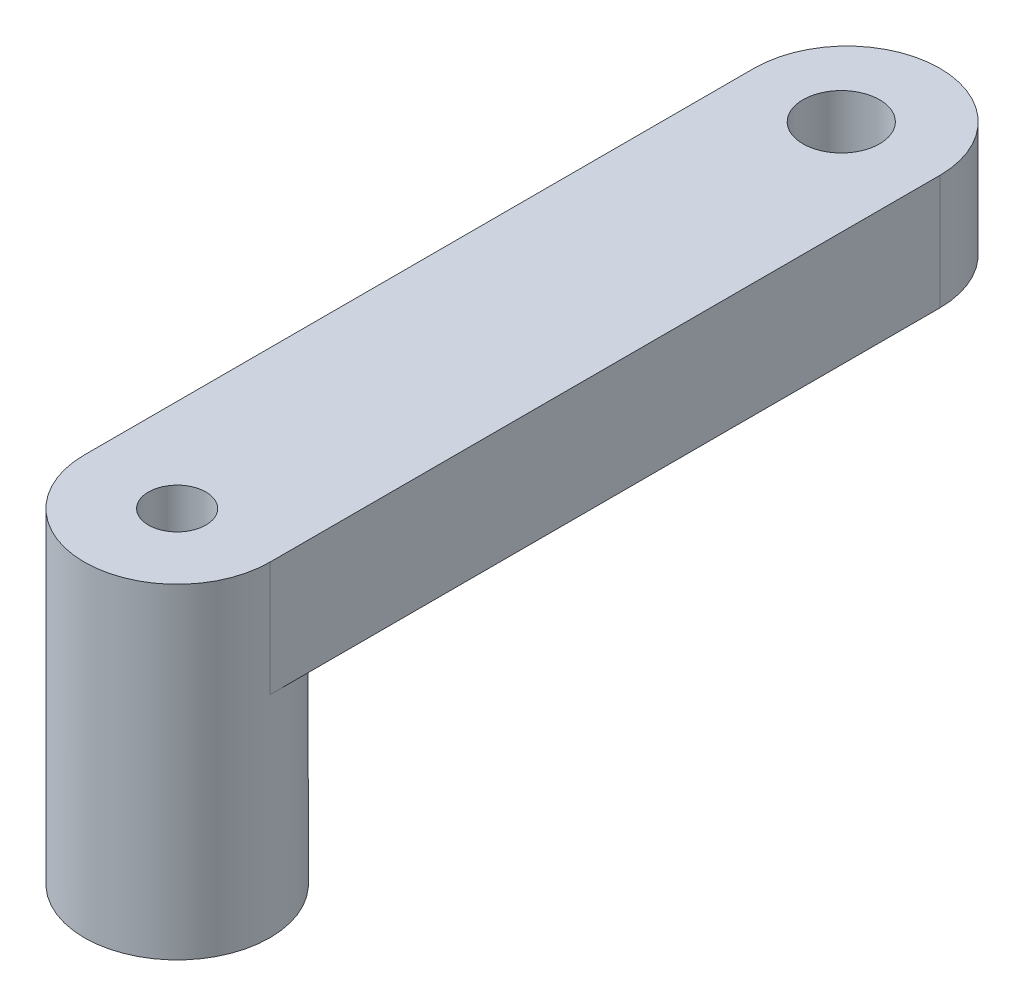
ISO-10303-21;
HEADER;
FILE_DESCRIPTION(('STEP AP214'),'2;1');
FILE_NAME('part.step','',(''),(''),'','','');
FILE_SCHEMA(('AUTOMOTIVE_DESIGN { 1 0 10303 214 1 1 1 1 }'));
ENDSEC;
DATA;
#1=APPLICATION_CONTEXT('core data for automotive mechanical design processes');
#2=APPLICATION_PROTOCOL_DEFINITION('international standard','automotive_design',2000,#1);
#3=PRODUCT_CONTEXT('',#1,'mechanical');
#4=PRODUCT('Part','Part','',(#3));
#5=PRODUCT_RELATED_PRODUCT_CATEGORY('part','',(#4));
#6=PRODUCT_DEFINITION_FORMATION('','',#4);
#7=PRODUCT_DEFINITION_CONTEXT('part definition',#1,'design');
#8=PRODUCT_DEFINITION('design','',#6,#7);
#9=PRODUCT_DEFINITION_SHAPE('','',#8);
#10=(LENGTH_UNIT() NAMED_UNIT(*) SI_UNIT(.MILLI.,.METRE.));
#11=(NAMED_UNIT(*) PLANE_ANGLE_UNIT() SI_UNIT($,.RADIAN.));
#12=(NAMED_UNIT(*) SI_UNIT($,.STERADIAN.) SOLID_ANGLE_UNIT());
#13=UNCERTAINTY_MEASURE_WITH_UNIT(LENGTH_MEASURE(1.E-05),#10,'distance_accuracy_value','');
#14=(GEOMETRIC_REPRESENTATION_CONTEXT(3) GLOBAL_UNCERTAINTY_ASSIGNED_CONTEXT((#13)) GLOBAL_UNIT_ASSIGNED_CONTEXT((#10,
#11,#12)) REPRESENTATION_CONTEXT('',''));
#15=CARTESIAN_POINT('',(0.,0.,0.));
#16=DIRECTION('',(0.,0.,1.));
#17=DIRECTION('',(1.,0.,0.));
#18=AXIS2_PLACEMENT_3D('',#15,#16,#17);
#19=CARTESIAN_POINT('',(0.,0.,0.));
#20=DIRECTION('',(0.,1.,0.));
#21=DIRECTION('',(0.,0.,1.));
#22=AXIS2_PLACEMENT_3D('',#19,#20,#21);
#23=PLANE('',#22);
#24=CARTESIAN_POINT('',(0.,0.,0.));
#25=DIRECTION('',(0.,1.,0.));
#26=DIRECTION('',(0.,0.,1.));
#27=AXIS2_PLACEMENT_3D('',#24,#25,#26);
#28=CIRCLE('',#27,4.85);
#29=CARTESIAN_POINT('',(0.,0.,4.85));
#30=VERTEX_POINT('',#29);
#31=EDGE_CURVE('E43',#30,#30,#28,.T.);
#32=ORIENTED_EDGE('',*,*,#31,.F.);
#33=EDGE_LOOP('',(#32));
#34=FACE_BOUND('',#33,.T.);
#35=CARTESIAN_POINT('',(0.,0.,0.));
#36=DIRECTION('',(0.,1.,0.));
#37=DIRECTION('',(0.,0.,1.));
#38=AXIS2_PLACEMENT_3D('',#35,#36,#37);
#39=CIRCLE('',#38,1.5);
#40=CARTESIAN_POINT('',(0.,0.,1.5));
#41=VERTEX_POINT('',#40);
#42=EDGE_CURVE('E112',#41,#41,#39,.T.);
#43=ORIENTED_EDGE('',*,*,#42,.T.);
#44=EDGE_LOOP('',(#43));
#45=FACE_BOUND('',#44,.T.);
#46=ADVANCED_FACE('F34',(#34,#45),#23,.F.);
#47=CARTESIAN_POINT('',(0.,11.,0.));
#48=DIRECTION('',(0.,-1.,0.));
#49=DIRECTION('',(0.,0.,-1.));
#50=AXIS2_PLACEMENT_3D('',#47,#48,#49);
#51=CYLINDRICAL_SURFACE('',#50,4.85);
#52=CARTESIAN_POINT('',(0.,11.,0.));
#53=DIRECTION('',(0.,1.,0.));
#54=DIRECTION('',(0.,0.,1.));
#55=AXIS2_PLACEMENT_3D('',#52,#53,#54);
#56=CIRCLE('',#55,4.85);
#57=CARTESIAN_POINT('',(4.85,11.,0.));
#58=VERTEX_POINT('',#57);
#59=CARTESIAN_POINT('',(-4.85,11.,0.));
#60=VERTEX_POINT('',#59);
#61=EDGE_CURVE('E11',#58,#60,#56,.T.);
#62=ORIENTED_EDGE('',*,*,#61,.F.);
#63=DIRECTION('',(0.,-1.,0.));
#64=VECTOR('',#63,1.);
#65=CARTESIAN_POINT('',(4.85,17.,0.));
#66=LINE('',#65,#64);
#67=CARTESIAN_POINT('',(4.85,17.,0.));
#68=VERTEX_POINT('',#67);
#69=EDGE_CURVE('E94',#68,#58,#66,.T.);
#70=ORIENTED_EDGE('',*,*,#69,.F.);
#71=CARTESIAN_POINT('',(0.,17.,0.));
#72=DIRECTION('',(0.,1.,0.));
#73=DIRECTION('',(0.,0.,1.));
#74=AXIS2_PLACEMENT_3D('',#71,#72,#73);
#75=CIRCLE('',#74,4.85);
#76=CARTESIAN_POINT('',(-4.85,17.,0.));
#77=VERTEX_POINT('',#76);
#78=EDGE_CURVE('E88',#77,#68,#75,.T.);
#79=ORIENTED_EDGE('',*,*,#78,.F.);
#80=DIRECTION('',(0.,-1.,0.));
#81=VECTOR('',#80,1.);
#82=CARTESIAN_POINT('',(-4.85,17.,0.));
#83=LINE('',#82,#81);
#84=EDGE_CURVE('E99',#77,#60,#83,.T.);
#85=ORIENTED_EDGE('',*,*,#84,.T.);
#86=EDGE_LOOP('',(#62,#70,#79,#85));
#87=FACE_BOUND('',#86,.T.);
#88=ORIENTED_EDGE('',*,*,#31,.T.);
#89=EDGE_LOOP('',(#88));
#90=FACE_BOUND('',#89,.T.);
#91=ADVANCED_FACE('F36',(#87,#90),#51,.T.);
#92=CARTESIAN_POINT('',(0.,11.,0.));
#93=DIRECTION('',(0.,-1.,0.));
#94=DIRECTION('',(0.,0.,-1.));
#95=AXIS2_PLACEMENT_3D('',#92,#93,#94);
#96=CYLINDRICAL_SURFACE('',#95,1.5);
#97=ORIENTED_EDGE('',*,*,#42,.F.);
#98=EDGE_LOOP('',(#97));
#99=FACE_BOUND('',#98,.T.);
#100=CARTESIAN_POINT('',(0.,17.,0.));
#101=DIRECTION('',(0.,1.,0.));
#102=DIRECTION('',(0.,0.,1.));
#103=AXIS2_PLACEMENT_3D('',#100,#101,#102);
#104=CIRCLE('',#103,1.5);
#105=CARTESIAN_POINT('',(0.,17.,1.5));
#106=VERTEX_POINT('',#105);
#107=EDGE_CURVE('E38',#106,#106,#104,.T.);
#108=ORIENTED_EDGE('',*,*,#107,.T.);
#109=EDGE_LOOP('',(#108));
#110=FACE_BOUND('',#109,.T.);
#111=ADVANCED_FACE('F122',(#99,#110),#96,.F.);
#112=CARTESIAN_POINT('',(0.,11.,0.));
#113=DIRECTION('',(0.,1.,0.));
#114=DIRECTION('',(0.,0.,1.));
#115=AXIS2_PLACEMENT_3D('',#112,#113,#114);
#116=PLANE('',#115);
#117=CARTESIAN_POINT('',(-0.150000000000001,11.,-34.8522505064779));
#118=DIRECTION('',(0.,1.,0.));
#119=DIRECTION('',(0.,0.,1.));
#120=AXIS2_PLACEMENT_3D('',#117,#118,#119);
#121=CIRCLE('',#120,2.00000000000001);
#122=CARTESIAN_POINT('',(-0.150000000000001,11.,-32.8522505064779));
#123=VERTEX_POINT('',#122);
#124=EDGE_CURVE('E104',#123,#123,#121,.T.);
#125=ORIENTED_EDGE('',*,*,#124,.T.);
#126=EDGE_LOOP('',(#125));
#127=FACE_BOUND('',#126,.T.);
#128=DIRECTION('',(0.,0.,-1.));
#129=VECTOR('',#128,1.);
#130=CARTESIAN_POINT('',(4.85,11.,-35.));
#131=LINE('',#130,#129);
#132=CARTESIAN_POINT('',(4.85,11.,-35.));
#133=VERTEX_POINT('',#132);
#134=EDGE_CURVE('E93',#58,#133,#131,.T.);
#135=ORIENTED_EDGE('',*,*,#134,.F.);
#136=ORIENTED_EDGE('',*,*,#61,.T.);
#137=DIRECTION('',(0.,0.,1.));
#138=VECTOR('',#137,1.);
#139=CARTESIAN_POINT('',(-4.85,11.,0.));
#140=LINE('',#139,#138);
#141=CARTESIAN_POINT('',(-4.85,11.,-35.));
#142=VERTEX_POINT('',#141);
#143=EDGE_CURVE('E106',#142,#60,#140,.T.);
#144=ORIENTED_EDGE('',*,*,#143,.F.);
#145=CARTESIAN_POINT('',(0.,11.,-35.));
#146=DIRECTION('',(0.,1.,0.));
#147=DIRECTION('',(0.,0.,-1.));
#148=AXIS2_PLACEMENT_3D('',#145,#146,#147);
#149=CIRCLE('',#148,4.85);
#150=EDGE_CURVE('E75',#133,#142,#149,.T.);
#151=ORIENTED_EDGE('',*,*,#150,.F.);
#152=EDGE_LOOP('',(#135,#136,#144,#151));
#153=FACE_BOUND('',#152,.T.);
#154=ADVANCED_FACE('F125',(#127,#153),#116,.F.);
#155=CARTESIAN_POINT('',(4.85,17.,-35.));
#156=DIRECTION('',(-1.,0.,0.));
#157=DIRECTION('',(0.,0.,1.));
#158=AXIS2_PLACEMENT_3D('',#155,#156,#157);
#159=PLANE('',#158);
#160=ORIENTED_EDGE('',*,*,#134,.T.);
#161=DIRECTION('',(0.,-1.,0.));
#162=VECTOR('',#161,1.);
#163=CARTESIAN_POINT('',(4.85,17.,-35.));
#164=LINE('',#163,#162);
#165=CARTESIAN_POINT('',(4.85,17.,-35.));
#166=VERTEX_POINT('',#165);
#167=EDGE_CURVE('E91',#166,#133,#164,.T.);
#168=ORIENTED_EDGE('',*,*,#167,.F.);
#169=DIRECTION('',(0.,0.,-1.));
#170=VECTOR('',#169,1.);
#171=CARTESIAN_POINT('',(4.85,17.,-35.));
#172=LINE('',#171,#170);
#173=EDGE_CURVE('E83',#68,#166,#172,.T.);
#174=ORIENTED_EDGE('',*,*,#173,.F.);
#175=ORIENTED_EDGE('',*,*,#69,.T.);
#176=EDGE_LOOP('',(#160,#168,#174,#175));
#177=FACE_BOUND('',#176,.T.);
#178=ADVANCED_FACE('F92',(#177),#159,.F.);
#179=CARTESIAN_POINT('',(0.,17.,-35.));
#180=DIRECTION('',(0.,-1.,0.));
#181=DIRECTION('',(0.,0.,-1.));
#182=AXIS2_PLACEMENT_3D('',#179,#180,#181);
#183=CYLINDRICAL_SURFACE('',#182,4.85);
#184=ORIENTED_EDGE('',*,*,#150,.T.);
#185=DIRECTION('',(0.,-1.,0.));
#186=VECTOR('',#185,1.);
#187=CARTESIAN_POINT('',(-4.85,17.,-35.));
#188=LINE('',#187,#186);
#189=CARTESIAN_POINT('',(-4.85,17.,-35.));
#190=VERTEX_POINT('',#189);
#191=EDGE_CURVE('E95',#190,#142,#188,.T.);
#192=ORIENTED_EDGE('',*,*,#191,.F.);
#193=CARTESIAN_POINT('',(0.,17.,-35.));
#194=DIRECTION('',(0.,1.,0.));
#195=DIRECTION('',(0.,0.,-1.));
#196=AXIS2_PLACEMENT_3D('',#193,#194,#195);
#197=CIRCLE('',#196,4.85);
#198=EDGE_CURVE('E86',#166,#190,#197,.T.);
#199=ORIENTED_EDGE('',*,*,#198,.F.);
#200=ORIENTED_EDGE('',*,*,#167,.T.);
#201=EDGE_LOOP('',(#184,#192,#199,#200));
#202=FACE_BOUND('',#201,.T.);
#203=ADVANCED_FACE('F97',(#202),#183,.T.);
#204=CARTESIAN_POINT('',(-4.85,17.,0.));
#205=DIRECTION('',(1.,0.,0.));
#206=DIRECTION('',(0.,0.,-1.));
#207=AXIS2_PLACEMENT_3D('',#204,#205,#206);
#208=PLANE('',#207);
#209=ORIENTED_EDGE('',*,*,#143,.T.);
#210=ORIENTED_EDGE('',*,*,#84,.F.);
#211=DIRECTION('',(0.,0.,1.));
#212=VECTOR('',#211,1.);
#213=CARTESIAN_POINT('',(-4.85,17.,0.));
#214=LINE('',#213,#212);
#215=EDGE_CURVE('E58',#190,#77,#214,.T.);
#216=ORIENTED_EDGE('',*,*,#215,.F.);
#217=ORIENTED_EDGE('',*,*,#191,.T.);
#218=EDGE_LOOP('',(#209,#210,#216,#217));
#219=FACE_BOUND('',#218,.T.);
#220=ADVANCED_FACE('F146',(#219),#208,.F.);
#221=CARTESIAN_POINT('',(0.,17.,0.));
#222=DIRECTION('',(0.,1.,0.));
#223=DIRECTION('',(0.,0.,1.));
#224=AXIS2_PLACEMENT_3D('',#221,#222,#223);
#225=PLANE('',#224);
#226=ORIENTED_EDGE('',*,*,#107,.F.);
#227=EDGE_LOOP('',(#226));
#228=FACE_BOUND('',#227,.T.);
#229=CARTESIAN_POINT('',(-0.150000000000001,17.,-34.8522505064779));
#230=DIRECTION('',(0.,1.,0.));
#231=DIRECTION('',(0.,0.,1.));
#232=AXIS2_PLACEMENT_3D('',#229,#230,#231);
#233=CIRCLE('',#232,2.00000000000001);
#234=CARTESIAN_POINT('',(-0.150000000000001,17.,-32.8522505064779));
#235=VERTEX_POINT('',#234);
#236=EDGE_CURVE('E130',#235,#235,#233,.T.);
#237=ORIENTED_EDGE('',*,*,#236,.F.);
#238=EDGE_LOOP('',(#237));
#239=FACE_BOUND('',#238,.T.);
#240=ORIENTED_EDGE('',*,*,#78,.T.);
#241=ORIENTED_EDGE('',*,*,#173,.T.);
#242=ORIENTED_EDGE('',*,*,#198,.T.);
#243=ORIENTED_EDGE('',*,*,#215,.T.);
#244=EDGE_LOOP('',(#240,#241,#242,#243));
#245=FACE_BOUND('',#244,.T.);
#246=ADVANCED_FACE('F84',(#228,#239,#245),#225,.T.);
#247=CARTESIAN_POINT('',(-0.150000000000001,10.,-34.8522505064779));
#248=DIRECTION('',(0.,1.,0.));
#249=DIRECTION('',(0.,0.,1.));
#250=AXIS2_PLACEMENT_3D('',#247,#248,#249);
#251=CYLINDRICAL_SURFACE('',#250,2.00000000000001);
#252=ORIENTED_EDGE('',*,*,#236,.T.);
#253=EDGE_LOOP('',(#252));
#254=FACE_BOUND('',#253,.T.);
#255=ORIENTED_EDGE('',*,*,#124,.F.);
#256=EDGE_LOOP('',(#255));
#257=FACE_BOUND('',#256,.T.);
#258=ADVANCED_FACE('F140',(#254,#257),#251,.F.);
#259=CLOSED_SHELL('',(#46,#91,#111,#154,#178,#203,#220,#246,#258));
#260=MANIFOLD_SOLID_BREP('B2',#259);
#261=ADVANCED_BREP_SHAPE_REPRESENTATION('',(#18,#260),#14);
#262=SHAPE_DEFINITION_REPRESENTATION(#9,#261);
ENDSEC;
END-ISO-10303-21;
